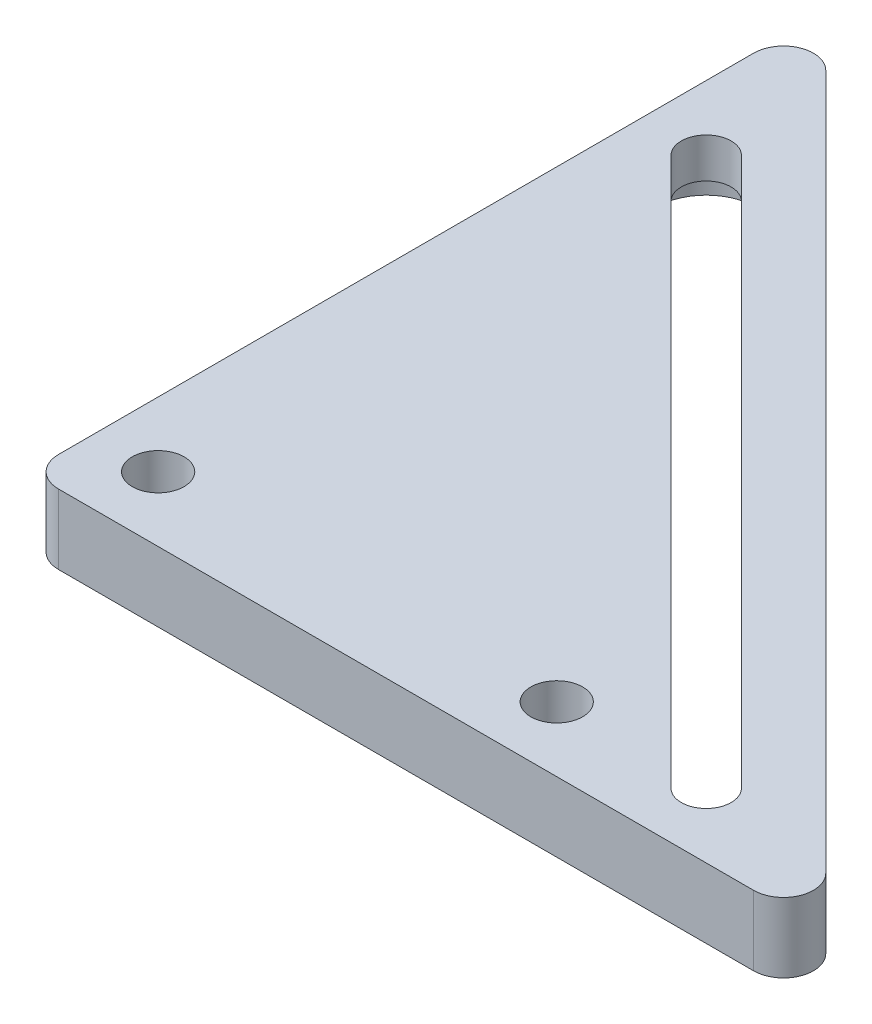
ISO-10303-21;
HEADER;
FILE_DESCRIPTION(('STEP AP214'),'2;1');
FILE_NAME('part.step','',(''),(''),'','','');
FILE_SCHEMA(('AUTOMOTIVE_DESIGN { 1 0 10303 214 1 1 1 1 }'));
ENDSEC;
DATA;
#1=APPLICATION_CONTEXT('core data for automotive mechanical design processes');
#2=APPLICATION_PROTOCOL_DEFINITION('international standard','automotive_design',2000,#1);
#3=PRODUCT_CONTEXT('',#1,'mechanical');
#4=PRODUCT('Part','Part','',(#3));
#5=PRODUCT_RELATED_PRODUCT_CATEGORY('part','',(#4));
#6=PRODUCT_DEFINITION_FORMATION('','',#4);
#7=PRODUCT_DEFINITION_CONTEXT('part definition',#1,'design');
#8=PRODUCT_DEFINITION('design','',#6,#7);
#9=PRODUCT_DEFINITION_SHAPE('','',#8);
#10=(LENGTH_UNIT() NAMED_UNIT(*) SI_UNIT(.MILLI.,.METRE.));
#11=(NAMED_UNIT(*) PLANE_ANGLE_UNIT() SI_UNIT($,.RADIAN.));
#12=(NAMED_UNIT(*) SI_UNIT($,.STERADIAN.) SOLID_ANGLE_UNIT());
#13=UNCERTAINTY_MEASURE_WITH_UNIT(LENGTH_MEASURE(1.E-05),#10,'distance_accuracy_value','');
#14=(GEOMETRIC_REPRESENTATION_CONTEXT(3) GLOBAL_UNCERTAINTY_ASSIGNED_CONTEXT((#13)) GLOBAL_UNIT_ASSIGNED_CONTEXT((#10,
#11,#12)) REPRESENTATION_CONTEXT('',''));
#15=CARTESIAN_POINT('',(0.,0.,0.));
#16=DIRECTION('',(0.,0.,1.));
#17=DIRECTION('',(1.,0.,0.));
#18=AXIS2_PLACEMENT_3D('',#15,#16,#17);
#19=CARTESIAN_POINT('',(6.5,0.,-6.5));
#20=DIRECTION('',(0.,1.,0.));
#21=DIRECTION('',(0.,0.,1.));
#22=AXIS2_PLACEMENT_3D('',#19,#20,#21);
#23=CYLINDRICAL_SURFACE('',#22,2.6);
#24=CARTESIAN_POINT('',(6.5,0.,-6.5));
#25=DIRECTION('',(0.,1.,0.));
#26=DIRECTION('',(0.,0.,1.));
#27=AXIS2_PLACEMENT_3D('',#24,#25,#26);
#28=CIRCLE('',#27,2.6);
#29=CARTESIAN_POINT('',(6.5,0.,-3.9));
#30=VERTEX_POINT('',#29);
#31=EDGE_CURVE('E287',#30,#30,#28,.T.);
#32=ORIENTED_EDGE('',*,*,#31,.F.);
#33=EDGE_LOOP('',(#32));
#34=FACE_BOUND('',#33,.T.);
#35=CARTESIAN_POINT('',(6.5,7.,-6.5));
#36=DIRECTION('',(0.,1.,0.));
#37=DIRECTION('',(0.,0.,1.));
#38=AXIS2_PLACEMENT_3D('',#35,#36,#37);
#39=CIRCLE('',#38,2.6);
#40=CARTESIAN_POINT('',(6.5,7.,-3.9));
#41=VERTEX_POINT('',#40);
#42=EDGE_CURVE('E236',#41,#41,#39,.F.);
#43=ORIENTED_EDGE('',*,*,#42,.F.);
#44=EDGE_LOOP('',(#43));
#45=FACE_BOUND('',#44,.T.);
#46=ADVANCED_FACE('F64',(#34,#45),#23,.F.);
#47=CARTESIAN_POINT('',(46.5,0.,-6.5));
#48=DIRECTION('',(0.,1.,0.));
#49=DIRECTION('',(0.,0.,1.));
#50=AXIS2_PLACEMENT_3D('',#47,#48,#49);
#51=CYLINDRICAL_SURFACE('',#50,2.6);
#52=CARTESIAN_POINT('',(46.5,0.,-6.5));
#53=DIRECTION('',(0.,1.,0.));
#54=DIRECTION('',(0.,0.,1.));
#55=AXIS2_PLACEMENT_3D('',#52,#53,#54);
#56=CIRCLE('',#55,2.6);
#57=CARTESIAN_POINT('',(46.5,0.,-3.9));
#58=VERTEX_POINT('',#57);
#59=EDGE_CURVE('E275',#58,#58,#56,.T.);
#60=ORIENTED_EDGE('',*,*,#59,.F.);
#61=EDGE_LOOP('',(#60));
#62=FACE_BOUND('',#61,.T.);
#63=CARTESIAN_POINT('',(46.5,7.,-6.5));
#64=DIRECTION('',(0.,1.,0.));
#65=DIRECTION('',(0.,0.,1.));
#66=AXIS2_PLACEMENT_3D('',#63,#64,#65);
#67=CIRCLE('',#66,2.6);
#68=CARTESIAN_POINT('',(46.5,7.,-3.9));
#69=VERTEX_POINT('',#68);
#70=EDGE_CURVE('E232',#69,#69,#67,.F.);
#71=ORIENTED_EDGE('',*,*,#70,.F.);
#72=EDGE_LOOP('',(#71));
#73=FACE_BOUND('',#72,.T.);
#74=ADVANCED_FACE('F367',(#62,#73),#51,.F.);
#75=CARTESIAN_POINT('',(3.,10.,-3.));
#76=DIRECTION('',(0.,1.,0.));
#77=DIRECTION('',(0.,0.,1.));
#78=AXIS2_PLACEMENT_3D('',#75,#76,#77);
#79=CYLINDRICAL_SURFACE('',#78,3.);
#80=DIRECTION('',(0.,1.,0.));
#81=VECTOR('',#80,1.);
#82=CARTESIAN_POINT('',(3.,10.,0.));
#83=LINE('',#82,#81);
#84=CARTESIAN_POINT('',(3.,7.,0.));
#85=VERTEX_POINT('',#84);
#86=CARTESIAN_POINT('',(3.,0.,0.));
#87=VERTEX_POINT('',#86);
#88=EDGE_CURVE('E327',#85,#87,#83,.F.);
#89=ORIENTED_EDGE('',*,*,#88,.F.);
#90=CARTESIAN_POINT('',(3.,7.,-3.));
#91=DIRECTION('',(0.,1.,0.));
#92=DIRECTION('',(0.,0.,1.));
#93=AXIS2_PLACEMENT_3D('',#90,#91,#92);
#94=CIRCLE('',#93,3.);
#95=CARTESIAN_POINT('',(0.,7.,-3.));
#96=VERTEX_POINT('',#95);
#97=EDGE_CURVE('E218',#85,#96,#94,.F.);
#98=ORIENTED_EDGE('',*,*,#97,.T.);
#99=DIRECTION('',(0.,1.,0.));
#100=VECTOR('',#99,1.);
#101=CARTESIAN_POINT('',(0.,10.,-3.));
#102=LINE('',#101,#100);
#103=CARTESIAN_POINT('',(0.,0.,-3.));
#104=VERTEX_POINT('',#103);
#105=EDGE_CURVE('E323',#104,#96,#102,.T.);
#106=ORIENTED_EDGE('',*,*,#105,.F.);
#107=CARTESIAN_POINT('',(3.,0.,-3.));
#108=DIRECTION('',(0.,1.,0.));
#109=DIRECTION('',(0.,0.,1.));
#110=AXIS2_PLACEMENT_3D('',#107,#108,#109);
#111=CIRCLE('',#110,3.);
#112=EDGE_CURVE('E73',#87,#104,#111,.F.);
#113=ORIENTED_EDGE('',*,*,#112,.F.);
#114=EDGE_LOOP('',(#89,#98,#106,#113));
#115=FACE_BOUND('',#114,.T.);
#116=ADVANCED_FACE('F66',(#115),#79,.T.);
#117=CARTESIAN_POINT('',(3.,10.,-72.7573593128807));
#118=DIRECTION('',(0.,1.,0.));
#119=DIRECTION('',(0.,0.,1.));
#120=AXIS2_PLACEMENT_3D('',#117,#118,#119);
#121=CYLINDRICAL_SURFACE('',#120,3.);
#122=DIRECTION('',(0.,1.,0.));
#123=VECTOR('',#122,1.);
#124=CARTESIAN_POINT('',(0.,10.,-72.7573593128807));
#125=LINE('',#124,#123);
#126=CARTESIAN_POINT('',(0.,7.,-72.7573593128807));
#127=VERTEX_POINT('',#126);
#128=CARTESIAN_POINT('',(0.,0.,-72.7573593128807));
#129=VERTEX_POINT('',#128);
#130=EDGE_CURVE('E317',#127,#129,#125,.F.);
#131=ORIENTED_EDGE('',*,*,#130,.F.);
#132=CARTESIAN_POINT('',(3.,7.,-72.7573593128807));
#133=DIRECTION('',(0.,1.,0.));
#134=DIRECTION('',(0.,0.,1.));
#135=AXIS2_PLACEMENT_3D('',#132,#133,#134);
#136=CIRCLE('',#135,3.);
#137=CARTESIAN_POINT('',(5.12132034355964,7.,-74.8786796564404));
#138=VERTEX_POINT('',#137);
#139=EDGE_CURVE('E209',#127,#138,#136,.F.);
#140=ORIENTED_EDGE('',*,*,#139,.T.);
#141=DIRECTION('',(0.,1.,0.));
#142=VECTOR('',#141,1.);
#143=CARTESIAN_POINT('',(5.12132034355964,10.,-74.8786796564404));
#144=LINE('',#143,#142);
#145=CARTESIAN_POINT('',(5.12132034355964,0.,-74.8786796564404));
#146=VERTEX_POINT('',#145);
#147=EDGE_CURVE('E313',#146,#138,#144,.T.);
#148=ORIENTED_EDGE('',*,*,#147,.F.);
#149=CARTESIAN_POINT('',(3.,0.,-72.7573593128807));
#150=DIRECTION('',(0.,1.,0.));
#151=DIRECTION('',(0.,0.,1.));
#152=AXIS2_PLACEMENT_3D('',#149,#150,#151);
#153=CIRCLE('',#152,3.);
#154=EDGE_CURVE('E320',#129,#146,#153,.F.);
#155=ORIENTED_EDGE('',*,*,#154,.F.);
#156=EDGE_LOOP('',(#131,#140,#148,#155));
#157=FACE_BOUND('',#156,.T.);
#158=ADVANCED_FACE('F345',(#157),#121,.T.);
#159=CARTESIAN_POINT('',(72.7573593128807,10.,-3.));
#160=DIRECTION('',(0.,1.,0.));
#161=DIRECTION('',(0.,0.,1.));
#162=AXIS2_PLACEMENT_3D('',#159,#160,#161);
#163=CYLINDRICAL_SURFACE('',#162,3.);
#164=DIRECTION('',(0.,1.,0.));
#165=VECTOR('',#164,1.);
#166=CARTESIAN_POINT('',(74.8786796564403,10.,-5.12132034355967));
#167=LINE('',#166,#165);
#168=CARTESIAN_POINT('',(74.8786796564403,7.,-5.12132034355967));
#169=VERTEX_POINT('',#168);
#170=CARTESIAN_POINT('',(74.8786796564403,0.,-5.12132034355967));
#171=VERTEX_POINT('',#170);
#172=EDGE_CURVE('E306',#169,#171,#167,.F.);
#173=ORIENTED_EDGE('',*,*,#172,.F.);
#174=CARTESIAN_POINT('',(72.7573593128807,7.,-3.));
#175=DIRECTION('',(0.,1.,0.));
#176=DIRECTION('',(0.,0.,1.));
#177=AXIS2_PLACEMENT_3D('',#174,#175,#176);
#178=CIRCLE('',#177,3.);
#179=CARTESIAN_POINT('',(72.7573593128807,7.,0.));
#180=VERTEX_POINT('',#179);
#181=EDGE_CURVE('E228',#169,#180,#178,.F.);
#182=ORIENTED_EDGE('',*,*,#181,.T.);
#183=DIRECTION('',(0.,1.,0.));
#184=VECTOR('',#183,1.);
#185=CARTESIAN_POINT('',(72.7573593128807,10.,0.));
#186=LINE('',#185,#184);
#187=CARTESIAN_POINT('',(72.7573593128807,0.,0.));
#188=VERTEX_POINT('',#187);
#189=EDGE_CURVE('E302',#188,#180,#186,.T.);
#190=ORIENTED_EDGE('',*,*,#189,.F.);
#191=CARTESIAN_POINT('',(72.7573593128807,0.,-3.));
#192=DIRECTION('',(0.,1.,0.));
#193=DIRECTION('',(0.,0.,1.));
#194=AXIS2_PLACEMENT_3D('',#191,#192,#193);
#195=CIRCLE('',#194,3.);
#196=EDGE_CURVE('E309',#171,#188,#195,.F.);
#197=ORIENTED_EDGE('',*,*,#196,.F.);
#198=EDGE_LOOP('',(#173,#182,#190,#197));
#199=FACE_BOUND('',#198,.T.);
#200=ADVANCED_FACE('F354',(#199),#163,.T.);
#201=CARTESIAN_POINT('',(0.,10.,0.));
#202=DIRECTION('',(0.,0.,-1.));
#203=DIRECTION('',(-1.,0.,0.));
#204=AXIS2_PLACEMENT_3D('',#201,#202,#203);
#205=PLANE('',#204);
#206=DIRECTION('',(1.,0.,0.));
#207=VECTOR('',#206,1.);
#208=CARTESIAN_POINT('',(0.,7.,0.));
#209=LINE('',#208,#207);
#210=EDGE_CURVE('E225',#85,#180,#209,.T.);
#211=ORIENTED_EDGE('',*,*,#210,.F.);
#212=ORIENTED_EDGE('',*,*,#88,.T.);
#213=DIRECTION('',(1.,0.,0.));
#214=VECTOR('',#213,1.);
#215=CARTESIAN_POINT('',(0.,0.,0.));
#216=LINE('',#215,#214);
#217=EDGE_CURVE('E291',#87,#188,#216,.T.);
#218=ORIENTED_EDGE('',*,*,#217,.T.);
#219=ORIENTED_EDGE('',*,*,#189,.T.);
#220=EDGE_LOOP('',(#211,#212,#218,#219));
#221=FACE_BOUND('',#220,.T.);
#222=ADVANCED_FACE('F357',(#221),#205,.F.);
#223=CARTESIAN_POINT('',(0.,10.,-80.));
#224=DIRECTION('',(-0.707106781186548,0.,0.707106781186548));
#225=DIRECTION('',(0.707106781186548,0.,0.707106781186548));
#226=AXIS2_PLACEMENT_3D('',#223,#224,#225);
#227=PLANE('',#226);
#228=DIRECTION('',(-0.707106781186548,0.,-0.707106781186548));
#229=VECTOR('',#228,1.);
#230=CARTESIAN_POINT('',(0.,7.,-80.));
#231=LINE('',#230,#229);
#232=EDGE_CURVE('E222',#169,#138,#231,.T.);
#233=ORIENTED_EDGE('',*,*,#232,.F.);
#234=ORIENTED_EDGE('',*,*,#172,.T.);
#235=DIRECTION('',(-0.707106781186548,0.,-0.707106781186548));
#236=VECTOR('',#235,1.);
#237=CARTESIAN_POINT('',(0.,0.,-80.));
#238=LINE('',#237,#236);
#239=EDGE_CURVE('E294',#171,#146,#238,.T.);
#240=ORIENTED_EDGE('',*,*,#239,.T.);
#241=ORIENTED_EDGE('',*,*,#147,.T.);
#242=EDGE_LOOP('',(#233,#234,#240,#241));
#243=FACE_BOUND('',#242,.T.);
#244=ADVANCED_FACE('F351',(#243),#227,.F.);
#245=CARTESIAN_POINT('',(0.,10.,0.));
#246=DIRECTION('',(1.,0.,0.));
#247=DIRECTION('',(0.,0.,-1.));
#248=AXIS2_PLACEMENT_3D('',#245,#246,#247);
#249=PLANE('',#248);
#250=DIRECTION('',(0.,0.,1.));
#251=VECTOR('',#250,1.);
#252=CARTESIAN_POINT('',(0.,7.,0.));
#253=LINE('',#252,#251);
#254=EDGE_CURVE('E12',#127,#96,#253,.T.);
#255=ORIENTED_EDGE('',*,*,#254,.F.);
#256=ORIENTED_EDGE('',*,*,#130,.T.);
#257=DIRECTION('',(0.,0.,1.));
#258=VECTOR('',#257,1.);
#259=CARTESIAN_POINT('',(0.,0.,0.));
#260=LINE('',#259,#258);
#261=EDGE_CURVE('E298',#129,#104,#260,.T.);
#262=ORIENTED_EDGE('',*,*,#261,.T.);
#263=ORIENTED_EDGE('',*,*,#105,.T.);
#264=EDGE_LOOP('',(#255,#256,#262,#263));
#265=FACE_BOUND('',#264,.T.);
#266=ADVANCED_FACE('F340',(#265),#249,.F.);
#267=CARTESIAN_POINT('',(0.,0.,0.));
#268=DIRECTION('',(0.,1.,0.));
#269=DIRECTION('',(0.,0.,1.));
#270=AXIS2_PLACEMENT_3D('',#267,#268,#269);
#271=PLANE('',#270);
#272=DIRECTION('',(0.707106781186548,0.,0.707106781186548));
#273=VECTOR('',#272,1.);
#274=CARTESIAN_POINT('',(37.5355339059327,0.,-37.5355339059327));
#275=LINE('',#274,#273);
#276=CARTESIAN_POINT('',(10.0355339059327,0.,-65.0355339059327));
#277=VERTEX_POINT('',#276);
#278=CARTESIAN_POINT('',(65.0355339059327,0.,-10.0355339059327));
#279=VERTEX_POINT('',#278);
#280=EDGE_CURVE('E240',#277,#279,#275,.T.);
#281=ORIENTED_EDGE('',*,*,#280,.F.);
#282=CARTESIAN_POINT('',(6.50000000000001,0.,-61.5));
#283=DIRECTION('',(0.,-1.,0.));
#284=DIRECTION('',(0.,0.,-1.));
#285=AXIS2_PLACEMENT_3D('',#282,#283,#284);
#286=CIRCLE('',#285,5.);
#287=CARTESIAN_POINT('',(2.96446609406727,0.,-57.9644660940673));
#288=VERTEX_POINT('',#287);
#289=EDGE_CURVE('E246',#288,#277,#286,.T.);
#290=ORIENTED_EDGE('',*,*,#289,.F.);
#291=DIRECTION('',(0.707106781186548,0.,0.707106781186548));
#292=VECTOR('',#291,1.);
#293=CARTESIAN_POINT('',(30.4644660940673,0.,-30.4644660940673));
#294=LINE('',#293,#292);
#295=CARTESIAN_POINT('',(57.9644660940673,0.,-2.96446609406726));
#296=VERTEX_POINT('',#295);
#297=EDGE_CURVE('E265',#288,#296,#294,.T.);
#298=ORIENTED_EDGE('',*,*,#297,.T.);
#299=CARTESIAN_POINT('',(61.5,0.,-6.5));
#300=DIRECTION('',(0.,-1.,0.));
#301=DIRECTION('',(0.,0.,-1.));
#302=AXIS2_PLACEMENT_3D('',#299,#300,#301);
#303=CIRCLE('',#302,5.);
#304=EDGE_CURVE('E261',#279,#296,#303,.T.);
#305=ORIENTED_EDGE('',*,*,#304,.F.);
#306=EDGE_LOOP('',(#281,#290,#298,#305));
#307=FACE_BOUND('',#306,.T.);
#308=ORIENTED_EDGE('',*,*,#59,.T.);
#309=EDGE_LOOP('',(#308));
#310=FACE_BOUND('',#309,.T.);
#311=ORIENTED_EDGE('',*,*,#31,.T.);
#312=EDGE_LOOP('',(#311));
#313=FACE_BOUND('',#312,.T.);
#314=ORIENTED_EDGE('',*,*,#217,.F.);
#315=ORIENTED_EDGE('',*,*,#112,.T.);
#316=ORIENTED_EDGE('',*,*,#261,.F.);
#317=ORIENTED_EDGE('',*,*,#154,.T.);
#318=ORIENTED_EDGE('',*,*,#239,.F.);
#319=ORIENTED_EDGE('',*,*,#196,.T.);
#320=EDGE_LOOP('',(#314,#315,#316,#317,#318,#319));
#321=FACE_BOUND('',#320,.T.);
#322=ADVANCED_FACE('F335',(#307,#310,#313,#321),#271,.F.);
#323=CARTESIAN_POINT('',(6.50000000000001,3.,-61.5));
#324=DIRECTION('',(0.,-1.,0.));
#325=DIRECTION('',(0.,0.,-1.));
#326=AXIS2_PLACEMENT_3D('',#323,#324,#325);
#327=CYLINDRICAL_SURFACE('',#326,5.);
#328=ORIENTED_EDGE('',*,*,#289,.T.);
#329=DIRECTION('',(0.,-1.,0.));
#330=VECTOR('',#329,1.);
#331=CARTESIAN_POINT('',(10.0355339059327,3.,-65.0355339059327));
#332=LINE('',#331,#330);
#333=CARTESIAN_POINT('',(10.0355339059327,3.,-65.0355339059327));
#334=VERTEX_POINT('',#333);
#335=EDGE_CURVE('E271',#334,#277,#332,.T.);
#336=ORIENTED_EDGE('',*,*,#335,.F.);
#337=CARTESIAN_POINT('',(6.50000000000001,3.,-61.5));
#338=DIRECTION('',(0.,-1.,0.));
#339=DIRECTION('',(0.,0.,-1.));
#340=AXIS2_PLACEMENT_3D('',#337,#338,#339);
#341=CIRCLE('',#340,5.);
#342=CARTESIAN_POINT('',(2.96446609406727,3.,-57.9644660940673));
#343=VERTEX_POINT('',#342);
#344=EDGE_CURVE('E253',#343,#334,#341,.T.);
#345=ORIENTED_EDGE('',*,*,#344,.F.);
#346=DIRECTION('',(0.,-1.,0.));
#347=VECTOR('',#346,1.);
#348=CARTESIAN_POINT('',(2.96446609406727,3.,-57.9644660940673));
#349=LINE('',#348,#347);
#350=EDGE_CURVE('E276',#343,#288,#349,.T.);
#351=ORIENTED_EDGE('',*,*,#350,.T.);
#352=EDGE_LOOP('',(#328,#336,#345,#351));
#353=FACE_BOUND('',#352,.T.);
#354=ADVANCED_FACE('F381',(#353),#327,.F.);
#355=CARTESIAN_POINT('',(30.4644660940673,3.,-30.4644660940673));
#356=DIRECTION('',(0.707106781186547,0.,-0.707106781186547));
#357=DIRECTION('',(-0.707106781186548,0.,-0.707106781186548));
#358=AXIS2_PLACEMENT_3D('',#355,#356,#357);
#359=PLANE('',#358);
#360=ORIENTED_EDGE('',*,*,#297,.F.);
#361=ORIENTED_EDGE('',*,*,#350,.F.);
#362=DIRECTION('',(0.707106781186548,0.,0.707106781186548));
#363=VECTOR('',#362,1.);
#364=CARTESIAN_POINT('',(30.4644660940673,3.,-30.4644660940673));
#365=LINE('',#364,#363);
#366=CARTESIAN_POINT('',(57.9644660940673,3.,-2.96446609406726));
#367=VERTEX_POINT('',#366);
#368=EDGE_CURVE('E250',#343,#367,#365,.T.);
#369=ORIENTED_EDGE('',*,*,#368,.T.);
#370=DIRECTION('',(0.,-1.,0.));
#371=VECTOR('',#370,1.);
#372=CARTESIAN_POINT('',(57.9644660940673,3.,-2.96446609406726));
#373=LINE('',#372,#371);
#374=EDGE_CURVE('E279',#367,#296,#373,.T.);
#375=ORIENTED_EDGE('',*,*,#374,.T.);
#376=EDGE_LOOP('',(#360,#361,#369,#375));
#377=FACE_BOUND('',#376,.T.);
#378=ADVANCED_FACE('F510',(#377),#359,.T.);
#379=CARTESIAN_POINT('',(61.5,3.,-6.5));
#380=DIRECTION('',(0.,-1.,0.));
#381=DIRECTION('',(0.,0.,-1.));
#382=AXIS2_PLACEMENT_3D('',#379,#380,#381);
#383=CYLINDRICAL_SURFACE('',#382,5.);
#384=ORIENTED_EDGE('',*,*,#304,.T.);
#385=ORIENTED_EDGE('',*,*,#374,.F.);
#386=CARTESIAN_POINT('',(61.5,3.,-6.5));
#387=DIRECTION('',(0.,-1.,0.));
#388=DIRECTION('',(0.,0.,-1.));
#389=AXIS2_PLACEMENT_3D('',#386,#387,#388);
#390=CIRCLE('',#389,5.);
#391=CARTESIAN_POINT('',(65.0355339059327,3.,-10.0355339059327));
#392=VERTEX_POINT('',#391);
#393=EDGE_CURVE('E245',#392,#367,#390,.T.);
#394=ORIENTED_EDGE('',*,*,#393,.F.);
#395=DIRECTION('',(0.,-1.,0.));
#396=VECTOR('',#395,1.);
#397=CARTESIAN_POINT('',(65.0355339059327,3.,-10.0355339059327));
#398=LINE('',#397,#396);
#399=EDGE_CURVE('E257',#392,#279,#398,.T.);
#400=ORIENTED_EDGE('',*,*,#399,.T.);
#401=EDGE_LOOP('',(#384,#385,#394,#400));
#402=FACE_BOUND('',#401,.T.);
#403=ADVANCED_FACE('F502',(#402),#383,.F.);
#404=CARTESIAN_POINT('',(37.5355339059327,3.,-37.5355339059327));
#405=DIRECTION('',(0.707106781186547,0.,-0.707106781186547));
#406=DIRECTION('',(-0.707106781186548,0.,-0.707106781186548));
#407=AXIS2_PLACEMENT_3D('',#404,#405,#406);
#408=PLANE('',#407);
#409=ORIENTED_EDGE('',*,*,#280,.T.);
#410=ORIENTED_EDGE('',*,*,#399,.F.);
#411=DIRECTION('',(0.707106781186548,0.,0.707106781186548));
#412=VECTOR('',#411,1.);
#413=CARTESIAN_POINT('',(37.5355339059327,3.,-37.5355339059327));
#414=LINE('',#413,#412);
#415=EDGE_CURVE('E241',#334,#392,#414,.T.);
#416=ORIENTED_EDGE('',*,*,#415,.F.);
#417=ORIENTED_EDGE('',*,*,#335,.T.);
#418=EDGE_LOOP('',(#409,#410,#416,#417));
#419=FACE_BOUND('',#418,.T.);
#420=ADVANCED_FACE('F454',(#419),#408,.F.);
#421=CARTESIAN_POINT('',(0.,3.,0.));
#422=DIRECTION('',(0.,-1.,0.));
#423=DIRECTION('',(0.,0.,-1.));
#424=AXIS2_PLACEMENT_3D('',#421,#422,#423);
#425=PLANE('',#424);
#426=CARTESIAN_POINT('',(6.50000000000001,3.,-61.5));
#427=DIRECTION('',(0.,-1.,0.));
#428=DIRECTION('',(0.,0.,-1.));
#429=AXIS2_PLACEMENT_3D('',#426,#427,#428);
#430=CIRCLE('',#429,2.5);
#431=CARTESIAN_POINT('',(4.73223304703364,3.,-59.7322330470336));
#432=VERTEX_POINT('',#431);
#433=CARTESIAN_POINT('',(8.26776695296638,3.,-63.2677669529664));
#434=VERTEX_POINT('',#433);
#435=EDGE_CURVE('E171',#432,#434,#430,.T.);
#436=ORIENTED_EDGE('',*,*,#435,.F.);
#437=DIRECTION('',(-0.707106781186547,0.,-0.707106781186547));
#438=VECTOR('',#437,1.);
#439=CARTESIAN_POINT('',(59.7322330470336,3.,-4.73223304703363));
#440=LINE('',#439,#438);
#441=CARTESIAN_POINT('',(59.7322330470336,3.,-4.73223304703363));
#442=VERTEX_POINT('',#441);
#443=EDGE_CURVE('E189',#442,#432,#440,.T.);
#444=ORIENTED_EDGE('',*,*,#443,.F.);
#445=CARTESIAN_POINT('',(61.5,3.,-6.5));
#446=DIRECTION('',(0.,-1.,0.));
#447=DIRECTION('',(0.,0.,-1.));
#448=AXIS2_PLACEMENT_3D('',#445,#446,#447);
#449=CIRCLE('',#448,2.5);
#450=CARTESIAN_POINT('',(63.2677669529664,3.,-8.26776695296638));
#451=VERTEX_POINT('',#450);
#452=EDGE_CURVE('E80',#451,#442,#449,.T.);
#453=ORIENTED_EDGE('',*,*,#452,.F.);
#454=DIRECTION('',(0.707106781186547,0.,0.707106781186547));
#455=VECTOR('',#454,1.);
#456=CARTESIAN_POINT('',(8.26776695296638,3.,-63.2677669529664));
#457=LINE('',#456,#455);
#458=EDGE_CURVE('E201',#434,#451,#457,.T.);
#459=ORIENTED_EDGE('',*,*,#458,.F.);
#460=EDGE_LOOP('',(#436,#444,#453,#459));
#461=FACE_BOUND('',#460,.T.);
#462=ORIENTED_EDGE('',*,*,#415,.T.);
#463=ORIENTED_EDGE('',*,*,#393,.T.);
#464=ORIENTED_EDGE('',*,*,#368,.F.);
#465=ORIENTED_EDGE('',*,*,#344,.T.);
#466=EDGE_LOOP('',(#462,#463,#464,#465));
#467=FACE_BOUND('',#466,.T.);
#468=ADVANCED_FACE('F360',(#461,#467),#425,.T.);
#469=CARTESIAN_POINT('',(0.,7.,0.));
#470=DIRECTION('',(0.,1.,0.));
#471=DIRECTION('',(0.,0.,1.));
#472=AXIS2_PLACEMENT_3D('',#469,#470,#471);
#473=PLANE('',#472);
#474=CARTESIAN_POINT('',(6.50000000000001,7.,-61.5));
#475=DIRECTION('',(0.,-1.,0.));
#476=DIRECTION('',(0.,0.,-1.));
#477=AXIS2_PLACEMENT_3D('',#474,#475,#476);
#478=CIRCLE('',#477,2.5);
#479=CARTESIAN_POINT('',(4.73223304703364,7.,-59.7322330470336));
#480=VERTEX_POINT('',#479);
#481=CARTESIAN_POINT('',(8.26776695296638,7.,-63.2677669529664));
#482=VERTEX_POINT('',#481);
#483=EDGE_CURVE('E168',#480,#482,#478,.T.);
#484=ORIENTED_EDGE('',*,*,#483,.T.);
#485=DIRECTION('',(0.707106781186547,0.,0.707106781186547));
#486=VECTOR('',#485,1.);
#487=CARTESIAN_POINT('',(8.26776695296638,7.,-63.2677669529664));
#488=LINE('',#487,#486);
#489=CARTESIAN_POINT('',(63.2677669529664,7.,-8.26776695296638));
#490=VERTEX_POINT('',#489);
#491=EDGE_CURVE('E180',#482,#490,#488,.T.);
#492=ORIENTED_EDGE('',*,*,#491,.T.);
#493=CARTESIAN_POINT('',(61.5,7.,-6.5));
#494=DIRECTION('',(0.,-1.,0.));
#495=DIRECTION('',(0.,0.,-1.));
#496=AXIS2_PLACEMENT_3D('',#493,#494,#495);
#497=CIRCLE('',#496,2.5);
#498=CARTESIAN_POINT('',(59.7322330470336,7.,-4.73223304703363));
#499=VERTEX_POINT('',#498);
#500=EDGE_CURVE('E85',#490,#499,#497,.T.);
#501=ORIENTED_EDGE('',*,*,#500,.T.);
#502=DIRECTION('',(-0.707106781186547,0.,-0.707106781186547));
#503=VECTOR('',#502,1.);
#504=CARTESIAN_POINT('',(59.7322330470336,7.,-4.73223304703363));
#505=LINE('',#504,#503);
#506=EDGE_CURVE('E177',#499,#480,#505,.T.);
#507=ORIENTED_EDGE('',*,*,#506,.T.);
#508=EDGE_LOOP('',(#484,#492,#501,#507));
#509=FACE_BOUND('',#508,.T.);
#510=ORIENTED_EDGE('',*,*,#232,.T.);
#511=ORIENTED_EDGE('',*,*,#139,.F.);
#512=ORIENTED_EDGE('',*,*,#254,.T.);
#513=ORIENTED_EDGE('',*,*,#97,.F.);
#514=ORIENTED_EDGE('',*,*,#210,.T.);
#515=ORIENTED_EDGE('',*,*,#181,.F.);
#516=EDGE_LOOP('',(#510,#511,#512,#513,#514,#515));
#517=FACE_BOUND('',#516,.T.);
#518=ORIENTED_EDGE('',*,*,#70,.T.);
#519=EDGE_LOOP('',(#518));
#520=FACE_BOUND('',#519,.T.);
#521=ORIENTED_EDGE('',*,*,#42,.T.);
#522=EDGE_LOOP('',(#521));
#523=FACE_BOUND('',#522,.T.);
#524=ADVANCED_FACE('F185',(#509,#517,#520,#523),#473,.T.);
#525=CARTESIAN_POINT('',(6.50000000000001,7.,-61.5));
#526=DIRECTION('',(0.,-1.,0.));
#527=DIRECTION('',(0.,0.,-1.));
#528=AXIS2_PLACEMENT_3D('',#525,#526,#527);
#529=CYLINDRICAL_SURFACE('',#528,2.5);
#530=ORIENTED_EDGE('',*,*,#435,.T.);
#531=DIRECTION('',(0.,-1.,0.));
#532=VECTOR('',#531,1.);
#533=CARTESIAN_POINT('',(8.26776695296638,7.,-63.2677669529664));
#534=LINE('',#533,#532);
#535=EDGE_CURVE('E164',#482,#434,#534,.T.);
#536=ORIENTED_EDGE('',*,*,#535,.F.);
#537=ORIENTED_EDGE('',*,*,#483,.F.);
#538=DIRECTION('',(0.,-1.,0.));
#539=VECTOR('',#538,1.);
#540=CARTESIAN_POINT('',(4.73223304703364,7.,-59.7322330470336));
#541=LINE('',#540,#539);
#542=EDGE_CURVE('E206',#480,#432,#541,.T.);
#543=ORIENTED_EDGE('',*,*,#542,.T.);
#544=EDGE_LOOP('',(#530,#536,#537,#543));
#545=FACE_BOUND('',#544,.T.);
#546=ADVANCED_FACE('F166',(#545),#529,.F.);
#547=CARTESIAN_POINT('',(59.7322330470336,7.,-4.73223304703363));
#548=DIRECTION('',(-0.707106781186547,0.,0.707106781186547));
#549=DIRECTION('',(0.707106781186548,0.,0.707106781186548));
#550=AXIS2_PLACEMENT_3D('',#547,#548,#549);
#551=PLANE('',#550);
#552=ORIENTED_EDGE('',*,*,#443,.T.);
#553=ORIENTED_EDGE('',*,*,#542,.F.);
#554=ORIENTED_EDGE('',*,*,#506,.F.);
#555=DIRECTION('',(0.,-1.,0.));
#556=VECTOR('',#555,1.);
#557=CARTESIAN_POINT('',(59.7322330470336,7.,-4.73223304703363));
#558=LINE('',#557,#556);
#559=EDGE_CURVE('E210',#499,#442,#558,.T.);
#560=ORIENTED_EDGE('',*,*,#559,.T.);
#561=EDGE_LOOP('',(#552,#553,#554,#560));
#562=FACE_BOUND('',#561,.T.);
#563=ADVANCED_FACE('F420',(#562),#551,.F.);
#564=CARTESIAN_POINT('',(61.5,7.,-6.5));
#565=DIRECTION('',(0.,-1.,0.));
#566=DIRECTION('',(0.,0.,-1.));
#567=AXIS2_PLACEMENT_3D('',#564,#565,#566);
#568=CYLINDRICAL_SURFACE('',#567,2.5);
#569=ORIENTED_EDGE('',*,*,#452,.T.);
#570=ORIENTED_EDGE('',*,*,#559,.F.);
#571=ORIENTED_EDGE('',*,*,#500,.F.);
#572=DIRECTION('',(0.,-1.,0.));
#573=VECTOR('',#572,1.);
#574=CARTESIAN_POINT('',(63.2677669529664,7.,-8.26776695296638));
#575=LINE('',#574,#573);
#576=EDGE_CURVE('E176',#490,#451,#575,.T.);
#577=ORIENTED_EDGE('',*,*,#576,.T.);
#578=EDGE_LOOP('',(#569,#570,#571,#577));
#579=FACE_BOUND('',#578,.T.);
#580=ADVANCED_FACE('F428',(#579),#568,.F.);
#581=CARTESIAN_POINT('',(8.26776695296638,7.,-63.2677669529664));
#582=DIRECTION('',(0.707106781186547,0.,-0.707106781186547));
#583=DIRECTION('',(-0.707106781186548,0.,-0.707106781186548));
#584=AXIS2_PLACEMENT_3D('',#581,#582,#583);
#585=PLANE('',#584);
#586=ORIENTED_EDGE('',*,*,#458,.T.);
#587=ORIENTED_EDGE('',*,*,#576,.F.);
#588=ORIENTED_EDGE('',*,*,#491,.F.);
#589=ORIENTED_EDGE('',*,*,#535,.T.);
#590=EDGE_LOOP('',(#586,#587,#588,#589));
#591=FACE_BOUND('',#590,.T.);
#592=ADVANCED_FACE('F181',(#591),#585,.F.);
#593=CLOSED_SHELL('',(#46,#74,#116,#158,#200,#222,#244,#266,#322,#354,#378,#403,#420,#468,#524,
#546,#563,#580,#592));
#594=MANIFOLD_SOLID_BREP('B2',#593);
#595=ADVANCED_BREP_SHAPE_REPRESENTATION('',(#18,#594),#14);
#596=SHAPE_DEFINITION_REPRESENTATION(#9,#595);
ENDSEC;
END-ISO-10303-21;
